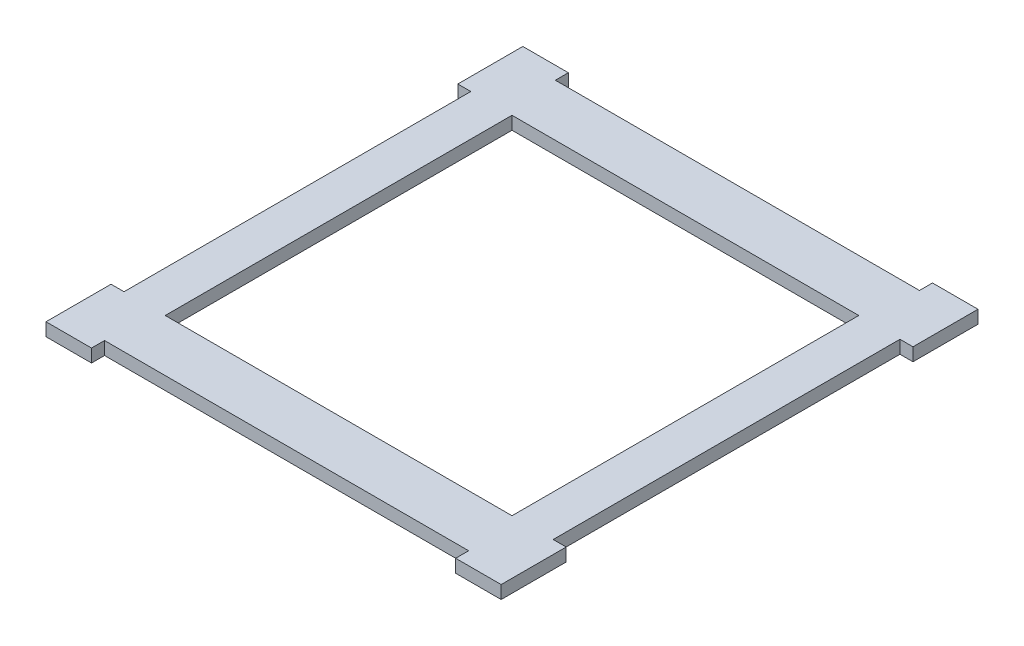
ISO-10303-21;
HEADER;
FILE_DESCRIPTION(('STEP AP214'),'2;1');
FILE_NAME('part.step','',(''),(''),'','','');
FILE_SCHEMA(('AUTOMOTIVE_DESIGN { 1 0 10303 214 1 1 1 1 }'));
ENDSEC;
DATA;
#1=APPLICATION_CONTEXT('core data for automotive mechanical design processes');
#2=APPLICATION_PROTOCOL_DEFINITION('international standard','automotive_design',2000,#1);
#3=PRODUCT_CONTEXT('',#1,'mechanical');
#4=PRODUCT('Part','Part','',(#3));
#5=PRODUCT_RELATED_PRODUCT_CATEGORY('part','',(#4));
#6=PRODUCT_DEFINITION_FORMATION('','',#4);
#7=PRODUCT_DEFINITION_CONTEXT('part definition',#1,'design');
#8=PRODUCT_DEFINITION('design','',#6,#7);
#9=PRODUCT_DEFINITION_SHAPE('','',#8);
#10=(LENGTH_UNIT() NAMED_UNIT(*) SI_UNIT(.MILLI.,.METRE.));
#11=(NAMED_UNIT(*) PLANE_ANGLE_UNIT() SI_UNIT($,.RADIAN.));
#12=(NAMED_UNIT(*) SI_UNIT($,.STERADIAN.) SOLID_ANGLE_UNIT());
#13=UNCERTAINTY_MEASURE_WITH_UNIT(LENGTH_MEASURE(1.E-05),#10,'distance_accuracy_value','');
#14=(GEOMETRIC_REPRESENTATION_CONTEXT(3) GLOBAL_UNCERTAINTY_ASSIGNED_CONTEXT((#13)) GLOBAL_UNIT_ASSIGNED_CONTEXT((#10,
#11,#12)) REPRESENTATION_CONTEXT('',''));
#15=CARTESIAN_POINT('',(0.,0.,0.));
#16=DIRECTION('',(0.,0.,1.));
#17=DIRECTION('',(1.,0.,0.));
#18=AXIS2_PLACEMENT_3D('',#15,#16,#17);
#19=CARTESIAN_POINT('',(0.,3.,0.));
#20=DIRECTION('',(0.,1.,0.));
#21=DIRECTION('',(0.,0.,1.));
#22=AXIS2_PLACEMENT_3D('',#19,#20,#21);
#23=PLANE('',#22);
#24=DIRECTION('',(-1.,0.,0.));
#25=VECTOR('',#24,1.);
#26=CARTESIAN_POINT('',(-40.,3.,-40.));
#27=LINE('',#26,#25);
#28=CARTESIAN_POINT('',(40.,3.,-40.));
#29=VERTEX_POINT('',#28);
#30=CARTESIAN_POINT('',(-40.,3.,-40.));
#31=VERTEX_POINT('',#30);
#32=EDGE_CURVE('E256',#29,#31,#27,.T.);
#33=ORIENTED_EDGE('',*,*,#32,.F.);
#34=DIRECTION('',(0.,0.,-1.));
#35=VECTOR('',#34,1.);
#36=CARTESIAN_POINT('',(40.,3.,-40.));
#37=LINE('',#36,#35);
#38=CARTESIAN_POINT('',(40.,3.,40.));
#39=VERTEX_POINT('',#38);
#40=EDGE_CURVE('E254',#39,#29,#37,.T.);
#41=ORIENTED_EDGE('',*,*,#40,.F.);
#42=DIRECTION('',(1.,0.,0.));
#43=VECTOR('',#42,1.);
#44=CARTESIAN_POINT('',(-40.,3.,40.));
#45=LINE('',#44,#43);
#46=CARTESIAN_POINT('',(-40.,3.,40.));
#47=VERTEX_POINT('',#46);
#48=EDGE_CURVE('E262',#47,#39,#45,.T.);
#49=ORIENTED_EDGE('',*,*,#48,.F.);
#50=DIRECTION('',(0.,0.,1.));
#51=VECTOR('',#50,1.);
#52=CARTESIAN_POINT('',(-40.,3.,-40.));
#53=LINE('',#52,#51);
#54=EDGE_CURVE('E259',#31,#47,#53,.T.);
#55=ORIENTED_EDGE('',*,*,#54,.F.);
#56=EDGE_LOOP('',(#33,#41,#49,#55));
#57=FACE_BOUND('',#56,.T.);
#58=DIRECTION('',(1.,0.,0.));
#59=VECTOR('',#58,1.);
#60=CARTESIAN_POINT('',(0.,3.,55.));
#61=LINE('',#60,#59);
#62=CARTESIAN_POINT('',(42.,3.,55.));
#63=VERTEX_POINT('',#62);
#64=CARTESIAN_POINT('',(52.5,3.,55.));
#65=VERTEX_POINT('',#64);
#66=EDGE_CURVE('E208',#63,#65,#61,.T.);
#67=ORIENTED_EDGE('',*,*,#66,.T.);
#68=DIRECTION('',(0.,0.,-1.));
#69=VECTOR('',#68,1.);
#70=CARTESIAN_POINT('',(52.5,3.,0.));
#71=LINE('',#70,#69);
#72=CARTESIAN_POINT('',(52.5,3.,40.));
#73=VERTEX_POINT('',#72);
#74=EDGE_CURVE('E391',#65,#73,#71,.T.);
#75=ORIENTED_EDGE('',*,*,#74,.T.);
#76=DIRECTION('',(-1.,0.,0.));
#77=VECTOR('',#76,1.);
#78=CARTESIAN_POINT('',(0.,3.,40.));
#79=LINE('',#78,#77);
#80=CARTESIAN_POINT('',(49.5,3.,40.));
#81=VERTEX_POINT('',#80);
#82=EDGE_CURVE('E335',#73,#81,#79,.T.);
#83=ORIENTED_EDGE('',*,*,#82,.T.);
#84=DIRECTION('',(0.,0.,1.));
#85=VECTOR('',#84,1.);
#86=CARTESIAN_POINT('',(49.5,3.,0.));
#87=LINE('',#86,#85);
#88=CARTESIAN_POINT('',(49.5,3.,-40.));
#89=VERTEX_POINT('',#88);
#90=EDGE_CURVE('E332',#89,#81,#87,.T.);
#91=ORIENTED_EDGE('',*,*,#90,.F.);
#92=DIRECTION('',(-1.,0.,0.));
#93=VECTOR('',#92,1.);
#94=CARTESIAN_POINT('',(0.,3.,-40.));
#95=LINE('',#94,#93);
#96=CARTESIAN_POINT('',(52.5,3.,-40.));
#97=VERTEX_POINT('',#96);
#98=EDGE_CURVE('E337',#97,#89,#95,.T.);
#99=ORIENTED_EDGE('',*,*,#98,.F.);
#100=DIRECTION('',(0.,0.,1.));
#101=VECTOR('',#100,1.);
#102=CARTESIAN_POINT('',(52.5,3.,0.));
#103=LINE('',#102,#101);
#104=CARTESIAN_POINT('',(52.5,3.,-55.));
#105=VERTEX_POINT('',#104);
#106=EDGE_CURVE('E353',#105,#97,#103,.T.);
#107=ORIENTED_EDGE('',*,*,#106,.F.);
#108=DIRECTION('',(1.,0.,0.));
#109=VECTOR('',#108,1.);
#110=CARTESIAN_POINT('',(0.,3.,-55.));
#111=LINE('',#110,#109);
#112=CARTESIAN_POINT('',(42.,3.,-55.));
#113=VERTEX_POINT('',#112);
#114=EDGE_CURVE('E351',#113,#105,#111,.T.);
#115=ORIENTED_EDGE('',*,*,#114,.F.);
#116=DIRECTION('',(0.,0.,1.));
#117=VECTOR('',#116,1.);
#118=CARTESIAN_POINT('',(42.,3.,-57.));
#119=LINE('',#118,#117);
#120=CARTESIAN_POINT('',(42.,3.,-52.));
#121=VERTEX_POINT('',#120);
#122=EDGE_CURVE('E237',#113,#121,#119,.T.);
#123=ORIENTED_EDGE('',*,*,#122,.T.);
#124=DIRECTION('',(-1.,0.,0.));
#125=VECTOR('',#124,1.);
#126=CARTESIAN_POINT('',(-54.5,3.,-52.));
#127=LINE('',#126,#125);
#128=CARTESIAN_POINT('',(-42.,3.,-52.));
#129=VERTEX_POINT('',#128);
#130=EDGE_CURVE('E285',#121,#129,#127,.T.);
#131=ORIENTED_EDGE('',*,*,#130,.T.);
#132=DIRECTION('',(0.,0.,1.));
#133=VECTOR('',#132,1.);
#134=CARTESIAN_POINT('',(-42.,3.,-57.));
#135=LINE('',#134,#133);
#136=CARTESIAN_POINT('',(-42.,3.,-55.));
#137=VERTEX_POINT('',#136);
#138=EDGE_CURVE('E251',#137,#129,#135,.T.);
#139=ORIENTED_EDGE('',*,*,#138,.F.);
#140=DIRECTION('',(-1.,0.,0.));
#141=VECTOR('',#140,1.);
#142=CARTESIAN_POINT('',(0.,3.,-55.));
#143=LINE('',#142,#141);
#144=CARTESIAN_POINT('',(-52.5,3.,-55.));
#145=VERTEX_POINT('',#144);
#146=EDGE_CURVE('E362',#137,#145,#143,.T.);
#147=ORIENTED_EDGE('',*,*,#146,.T.);
#148=DIRECTION('',(0.,0.,1.));
#149=VECTOR('',#148,1.);
#150=CARTESIAN_POINT('',(-52.5,3.,0.));
#151=LINE('',#150,#149);
#152=CARTESIAN_POINT('',(-52.5,3.,-40.));
#153=VERTEX_POINT('',#152);
#154=EDGE_CURVE('E365',#145,#153,#151,.T.);
#155=ORIENTED_EDGE('',*,*,#154,.T.);
#156=DIRECTION('',(1.,0.,0.));
#157=VECTOR('',#156,1.);
#158=CARTESIAN_POINT('',(0.,3.,-40.));
#159=LINE('',#158,#157);
#160=CARTESIAN_POINT('',(-49.5,3.,-40.));
#161=VERTEX_POINT('',#160);
#162=EDGE_CURVE('E317',#153,#161,#159,.T.);
#163=ORIENTED_EDGE('',*,*,#162,.T.);
#164=DIRECTION('',(0.,0.,1.));
#165=VECTOR('',#164,1.);
#166=CARTESIAN_POINT('',(-49.5,3.,0.));
#167=LINE('',#166,#165);
#168=CARTESIAN_POINT('',(-49.5,3.,40.));
#169=VERTEX_POINT('',#168);
#170=EDGE_CURVE('E229',#161,#169,#167,.T.);
#171=ORIENTED_EDGE('',*,*,#170,.T.);
#172=DIRECTION('',(1.,0.,0.));
#173=VECTOR('',#172,1.);
#174=CARTESIAN_POINT('',(0.,3.,40.));
#175=LINE('',#174,#173);
#176=CARTESIAN_POINT('',(-52.5,3.,40.));
#177=VERTEX_POINT('',#176);
#178=EDGE_CURVE('E307',#177,#169,#175,.T.);
#179=ORIENTED_EDGE('',*,*,#178,.F.);
#180=DIRECTION('',(0.,0.,-1.));
#181=VECTOR('',#180,1.);
#182=CARTESIAN_POINT('',(-52.5,3.,0.));
#183=LINE('',#182,#181);
#184=CARTESIAN_POINT('',(-52.5,3.,55.));
#185=VERTEX_POINT('',#184);
#186=EDGE_CURVE('E63',#185,#177,#183,.T.);
#187=ORIENTED_EDGE('',*,*,#186,.F.);
#188=DIRECTION('',(-1.,0.,0.));
#189=VECTOR('',#188,1.);
#190=CARTESIAN_POINT('',(0.,3.,55.));
#191=LINE('',#190,#189);
#192=CARTESIAN_POINT('',(-42.,3.,55.));
#193=VERTEX_POINT('',#192);
#194=EDGE_CURVE('E378',#193,#185,#191,.T.);
#195=ORIENTED_EDGE('',*,*,#194,.F.);
#196=DIRECTION('',(0.,0.,-1.));
#197=VECTOR('',#196,1.);
#198=CARTESIAN_POINT('',(-42.,3.,57.));
#199=LINE('',#198,#197);
#200=CARTESIAN_POINT('',(-42.,3.,52.));
#201=VERTEX_POINT('',#200);
#202=EDGE_CURVE('E244',#193,#201,#199,.T.);
#203=ORIENTED_EDGE('',*,*,#202,.T.);
#204=DIRECTION('',(1.,0.,0.));
#205=VECTOR('',#204,1.);
#206=CARTESIAN_POINT('',(-54.5,3.,52.));
#207=LINE('',#206,#205);
#208=CARTESIAN_POINT('',(42.,3.,52.));
#209=VERTEX_POINT('',#208);
#210=EDGE_CURVE('E288',#201,#209,#207,.T.);
#211=ORIENTED_EDGE('',*,*,#210,.T.);
#212=DIRECTION('',(0.,0.,-1.));
#213=VECTOR('',#212,1.);
#214=CARTESIAN_POINT('',(42.,3.,57.));
#215=LINE('',#214,#213);
#216=EDGE_CURVE('E225',#63,#209,#215,.T.);
#217=ORIENTED_EDGE('',*,*,#216,.F.);
#218=EDGE_LOOP('',(#67,#75,#83,#91,#99,#107,#115,#123,#131,#139,#147,#155,#163,#171,#179,#187,
#195,#203,#211,#217));
#219=FACE_BOUND('',#218,.T.);
#220=ADVANCED_FACE('F41',(#57,#219),#23,.T.);
#221=CARTESIAN_POINT('',(0.,0.,0.));
#222=DIRECTION('',(0.,1.,0.));
#223=DIRECTION('',(0.,0.,1.));
#224=AXIS2_PLACEMENT_3D('',#221,#222,#223);
#225=PLANE('',#224);
#226=DIRECTION('',(0.,0.,-1.));
#227=VECTOR('',#226,1.);
#228=CARTESIAN_POINT('',(40.,0.,-40.));
#229=LINE('',#228,#227);
#230=CARTESIAN_POINT('',(40.,0.,40.));
#231=VERTEX_POINT('',#230);
#232=CARTESIAN_POINT('',(40.,0.,-40.));
#233=VERTEX_POINT('',#232);
#234=EDGE_CURVE('E253',#231,#233,#229,.T.);
#235=ORIENTED_EDGE('',*,*,#234,.T.);
#236=DIRECTION('',(-1.,0.,0.));
#237=VECTOR('',#236,1.);
#238=CARTESIAN_POINT('',(-40.,0.,-40.));
#239=LINE('',#238,#237);
#240=CARTESIAN_POINT('',(-40.,0.,-40.));
#241=VERTEX_POINT('',#240);
#242=EDGE_CURVE('E267',#233,#241,#239,.T.);
#243=ORIENTED_EDGE('',*,*,#242,.T.);
#244=DIRECTION('',(0.,0.,1.));
#245=VECTOR('',#244,1.);
#246=CARTESIAN_POINT('',(-40.,0.,-40.));
#247=LINE('',#246,#245);
#248=CARTESIAN_POINT('',(-40.,0.,40.));
#249=VERTEX_POINT('',#248);
#250=EDGE_CURVE('E270',#241,#249,#247,.T.);
#251=ORIENTED_EDGE('',*,*,#250,.T.);
#252=DIRECTION('',(1.,0.,0.));
#253=VECTOR('',#252,1.);
#254=CARTESIAN_POINT('',(-40.,0.,40.));
#255=LINE('',#254,#253);
#256=EDGE_CURVE('E257',#249,#231,#255,.T.);
#257=ORIENTED_EDGE('',*,*,#256,.T.);
#258=EDGE_LOOP('',(#235,#243,#251,#257));
#259=FACE_BOUND('',#258,.T.);
#260=DIRECTION('',(0.,0.,1.));
#261=VECTOR('',#260,1.);
#262=CARTESIAN_POINT('',(52.5,0.,0.));
#263=LINE('',#262,#261);
#264=CARTESIAN_POINT('',(52.5,0.,40.));
#265=VERTEX_POINT('',#264);
#266=CARTESIAN_POINT('',(52.5,0.,55.));
#267=VERTEX_POINT('',#266);
#268=EDGE_CURVE('E56',#265,#267,#263,.T.);
#269=ORIENTED_EDGE('',*,*,#268,.T.);
#270=DIRECTION('',(-1.,0.,0.));
#271=VECTOR('',#270,1.);
#272=CARTESIAN_POINT('',(0.,0.,55.));
#273=LINE('',#272,#271);
#274=CARTESIAN_POINT('',(42.,0.,55.));
#275=VERTEX_POINT('',#274);
#276=EDGE_CURVE('E206',#267,#275,#273,.T.);
#277=ORIENTED_EDGE('',*,*,#276,.T.);
#278=DIRECTION('',(0.,0.,-1.));
#279=VECTOR('',#278,1.);
#280=CARTESIAN_POINT('',(42.,0.,57.));
#281=LINE('',#280,#279);
#282=CARTESIAN_POINT('',(42.,0.,52.));
#283=VERTEX_POINT('',#282);
#284=EDGE_CURVE('E217',#275,#283,#281,.T.);
#285=ORIENTED_EDGE('',*,*,#284,.T.);
#286=DIRECTION('',(1.,0.,0.));
#287=VECTOR('',#286,1.);
#288=CARTESIAN_POINT('',(-54.5,0.,52.));
#289=LINE('',#288,#287);
#290=CARTESIAN_POINT('',(-42.,0.,52.));
#291=VERTEX_POINT('',#290);
#292=EDGE_CURVE('E289',#291,#283,#289,.T.);
#293=ORIENTED_EDGE('',*,*,#292,.F.);
#294=DIRECTION('',(0.,0.,-1.));
#295=VECTOR('',#294,1.);
#296=CARTESIAN_POINT('',(-42.,0.,57.));
#297=LINE('',#296,#295);
#298=CARTESIAN_POINT('',(-42.,0.,55.));
#299=VERTEX_POINT('',#298);
#300=EDGE_CURVE('E242',#299,#291,#297,.T.);
#301=ORIENTED_EDGE('',*,*,#300,.F.);
#302=DIRECTION('',(1.,0.,0.));
#303=VECTOR('',#302,1.);
#304=CARTESIAN_POINT('',(0.,0.,55.));
#305=LINE('',#304,#303);
#306=CARTESIAN_POINT('',(-52.5,0.,55.));
#307=VERTEX_POINT('',#306);
#308=EDGE_CURVE('E384',#307,#299,#305,.T.);
#309=ORIENTED_EDGE('',*,*,#308,.F.);
#310=DIRECTION('',(0.,0.,1.));
#311=VECTOR('',#310,1.);
#312=CARTESIAN_POINT('',(-52.5,0.,0.));
#313=LINE('',#312,#311);
#314=CARTESIAN_POINT('',(-52.5,0.,40.));
#315=VERTEX_POINT('',#314);
#316=EDGE_CURVE('E388',#315,#307,#313,.T.);
#317=ORIENTED_EDGE('',*,*,#316,.F.);
#318=DIRECTION('',(-1.,0.,0.));
#319=VECTOR('',#318,1.);
#320=CARTESIAN_POINT('',(0.,0.,40.));
#321=LINE('',#320,#319);
#322=CARTESIAN_POINT('',(-49.5,0.,40.));
#323=VERTEX_POINT('',#322);
#324=EDGE_CURVE('E310',#323,#315,#321,.T.);
#325=ORIENTED_EDGE('',*,*,#324,.F.);
#326=DIRECTION('',(0.,0.,-1.));
#327=VECTOR('',#326,1.);
#328=CARTESIAN_POINT('',(-49.5,0.,0.));
#329=LINE('',#328,#327);
#330=CARTESIAN_POINT('',(-49.5,0.,-40.));
#331=VERTEX_POINT('',#330);
#332=EDGE_CURVE('E329',#323,#331,#329,.T.);
#333=ORIENTED_EDGE('',*,*,#332,.T.);
#334=DIRECTION('',(-1.,0.,0.));
#335=VECTOR('',#334,1.);
#336=CARTESIAN_POINT('',(0.,0.,-40.));
#337=LINE('',#336,#335);
#338=CARTESIAN_POINT('',(-52.5,0.,-40.));
#339=VERTEX_POINT('',#338);
#340=EDGE_CURVE('E324',#331,#339,#337,.T.);
#341=ORIENTED_EDGE('',*,*,#340,.T.);
#342=DIRECTION('',(0.,0.,-1.));
#343=VECTOR('',#342,1.);
#344=CARTESIAN_POINT('',(-52.5,0.,0.));
#345=LINE('',#344,#343);
#346=CARTESIAN_POINT('',(-52.5,0.,-55.));
#347=VERTEX_POINT('',#346);
#348=EDGE_CURVE('E371',#339,#347,#345,.T.);
#349=ORIENTED_EDGE('',*,*,#348,.T.);
#350=DIRECTION('',(1.,0.,0.));
#351=VECTOR('',#350,1.);
#352=CARTESIAN_POINT('',(0.,0.,-55.));
#353=LINE('',#352,#351);
#354=CARTESIAN_POINT('',(-42.,0.,-55.));
#355=VERTEX_POINT('',#354);
#356=EDGE_CURVE('E375',#347,#355,#353,.T.);
#357=ORIENTED_EDGE('',*,*,#356,.T.);
#358=DIRECTION('',(0.,0.,1.));
#359=VECTOR('',#358,1.);
#360=CARTESIAN_POINT('',(-42.,0.,-57.));
#361=LINE('',#360,#359);
#362=CARTESIAN_POINT('',(-42.,0.,-52.));
#363=VERTEX_POINT('',#362);
#364=EDGE_CURVE('E249',#355,#363,#361,.T.);
#365=ORIENTED_EDGE('',*,*,#364,.T.);
#366=DIRECTION('',(-1.,0.,0.));
#367=VECTOR('',#366,1.);
#368=CARTESIAN_POINT('',(-54.5,0.,-52.));
#369=LINE('',#368,#367);
#370=CARTESIAN_POINT('',(42.,0.,-52.));
#371=VERTEX_POINT('',#370);
#372=EDGE_CURVE('E284',#371,#363,#369,.T.);
#373=ORIENTED_EDGE('',*,*,#372,.F.);
#374=DIRECTION('',(0.,0.,1.));
#375=VECTOR('',#374,1.);
#376=CARTESIAN_POINT('',(42.,0.,-57.));
#377=LINE('',#376,#375);
#378=CARTESIAN_POINT('',(42.,0.,-55.));
#379=VERTEX_POINT('',#378);
#380=EDGE_CURVE('E235',#379,#371,#377,.T.);
#381=ORIENTED_EDGE('',*,*,#380,.F.);
#382=DIRECTION('',(-1.,0.,0.));
#383=VECTOR('',#382,1.);
#384=CARTESIAN_POINT('',(0.,0.,-55.));
#385=LINE('',#384,#383);
#386=CARTESIAN_POINT('',(52.5,0.,-55.));
#387=VERTEX_POINT('',#386);
#388=EDGE_CURVE('E357',#387,#379,#385,.T.);
#389=ORIENTED_EDGE('',*,*,#388,.F.);
#390=DIRECTION('',(0.,0.,-1.));
#391=VECTOR('',#390,1.);
#392=CARTESIAN_POINT('',(52.5,0.,0.));
#393=LINE('',#392,#391);
#394=CARTESIAN_POINT('',(52.5,0.,-40.));
#395=VERTEX_POINT('',#394);
#396=EDGE_CURVE('E359',#395,#387,#393,.T.);
#397=ORIENTED_EDGE('',*,*,#396,.F.);
#398=DIRECTION('',(1.,0.,0.));
#399=VECTOR('',#398,1.);
#400=CARTESIAN_POINT('',(0.,0.,-40.));
#401=LINE('',#400,#399);
#402=CARTESIAN_POINT('',(49.5,0.,-40.));
#403=VERTEX_POINT('',#402);
#404=EDGE_CURVE('E345',#403,#395,#401,.T.);
#405=ORIENTED_EDGE('',*,*,#404,.F.);
#406=DIRECTION('',(0.,0.,-1.));
#407=VECTOR('',#406,1.);
#408=CARTESIAN_POINT('',(49.5,0.,0.));
#409=LINE('',#408,#407);
#410=CARTESIAN_POINT('',(49.5,0.,40.));
#411=VERTEX_POINT('',#410);
#412=EDGE_CURVE('E348',#411,#403,#409,.T.);
#413=ORIENTED_EDGE('',*,*,#412,.F.);
#414=DIRECTION('',(1.,0.,0.));
#415=VECTOR('',#414,1.);
#416=CARTESIAN_POINT('',(0.,0.,40.));
#417=LINE('',#416,#415);
#418=EDGE_CURVE('E342',#411,#265,#417,.T.);
#419=ORIENTED_EDGE('',*,*,#418,.T.);
#420=EDGE_LOOP('',(#269,#277,#285,#293,#301,#309,#317,#325,#333,#341,#349,#357,#365,#373,#381,
#389,#397,#405,#413,#419));
#421=FACE_BOUND('',#420,.T.);
#422=ADVANCED_FACE('F215',(#259,#421),#225,.F.);
#423=CARTESIAN_POINT('',(42.,3.,57.));
#424=DIRECTION('',(1.,0.,0.));
#425=DIRECTION('',(0.,0.,-1.));
#426=AXIS2_PLACEMENT_3D('',#423,#424,#425);
#427=PLANE('',#426);
#428=DIRECTION('',(0.,-1.,0.));
#429=VECTOR('',#428,1.);
#430=CARTESIAN_POINT('',(42.,10.,55.));
#431=LINE('',#430,#429);
#432=EDGE_CURVE('E202',#63,#275,#431,.T.);
#433=ORIENTED_EDGE('',*,*,#432,.F.);
#434=ORIENTED_EDGE('',*,*,#216,.T.);
#435=DIRECTION('',(0.,-1.,0.));
#436=VECTOR('',#435,1.);
#437=CARTESIAN_POINT('',(42.,3.,52.));
#438=LINE('',#437,#436);
#439=EDGE_CURVE('E224',#209,#283,#438,.T.);
#440=ORIENTED_EDGE('',*,*,#439,.T.);
#441=ORIENTED_EDGE('',*,*,#284,.F.);
#442=EDGE_LOOP('',(#433,#434,#440,#441));
#443=FACE_BOUND('',#442,.T.);
#444=ADVANCED_FACE('F222',(#443),#427,.F.);
#445=CARTESIAN_POINT('',(0.,5.,40.));
#446=DIRECTION('',(0.,0.,-1.));
#447=DIRECTION('',(-1.,0.,0.));
#448=AXIS2_PLACEMENT_3D('',#445,#446,#447);
#449=PLANE('',#448);
#450=ORIENTED_EDGE('',*,*,#82,.F.);
#451=DIRECTION('',(0.,-1.,0.));
#452=VECTOR('',#451,1.);
#453=CARTESIAN_POINT('',(52.5,5.,40.));
#454=LINE('',#453,#452);
#455=EDGE_CURVE('E12',#73,#265,#454,.T.);
#456=ORIENTED_EDGE('',*,*,#455,.T.);
#457=ORIENTED_EDGE('',*,*,#418,.F.);
#458=DIRECTION('',(0.,-1.,0.));
#459=VECTOR('',#458,1.);
#460=CARTESIAN_POINT('',(49.5,5.,40.));
#461=LINE('',#460,#459);
#462=EDGE_CURVE('E339',#81,#411,#461,.T.);
#463=ORIENTED_EDGE('',*,*,#462,.F.);
#464=EDGE_LOOP('',(#450,#456,#457,#463));
#465=FACE_BOUND('',#464,.T.);
#466=ADVANCED_FACE('F457',(#465),#449,.T.);
#467=CARTESIAN_POINT('',(-42.,3.,-57.));
#468=DIRECTION('',(-1.,0.,0.));
#469=DIRECTION('',(0.,0.,1.));
#470=AXIS2_PLACEMENT_3D('',#467,#468,#469);
#471=PLANE('',#470);
#472=DIRECTION('',(0.,-1.,0.));
#473=VECTOR('',#472,1.);
#474=CARTESIAN_POINT('',(-42.,10.,-55.));
#475=LINE('',#474,#473);
#476=EDGE_CURVE('E369',#137,#355,#475,.T.);
#477=ORIENTED_EDGE('',*,*,#476,.F.);
#478=ORIENTED_EDGE('',*,*,#138,.T.);
#479=DIRECTION('',(0.,-1.,0.));
#480=VECTOR('',#479,1.);
#481=CARTESIAN_POINT('',(-42.,3.,-52.));
#482=LINE('',#481,#480);
#483=EDGE_CURVE('E246',#129,#363,#482,.T.);
#484=ORIENTED_EDGE('',*,*,#483,.T.);
#485=ORIENTED_EDGE('',*,*,#364,.F.);
#486=EDGE_LOOP('',(#477,#478,#484,#485));
#487=FACE_BOUND('',#486,.T.);
#488=ADVANCED_FACE('F427',(#487),#471,.F.);
#489=CARTESIAN_POINT('',(0.,5.,-40.));
#490=DIRECTION('',(0.,0.,1.));
#491=DIRECTION('',(1.,0.,0.));
#492=AXIS2_PLACEMENT_3D('',#489,#490,#491);
#493=PLANE('',#492);
#494=ORIENTED_EDGE('',*,*,#162,.F.);
#495=DIRECTION('',(0.,-1.,0.));
#496=VECTOR('',#495,1.);
#497=CARTESIAN_POINT('',(-52.5,5.,-40.));
#498=LINE('',#497,#496);
#499=EDGE_CURVE('E301',#153,#339,#498,.T.);
#500=ORIENTED_EDGE('',*,*,#499,.T.);
#501=ORIENTED_EDGE('',*,*,#340,.F.);
#502=DIRECTION('',(0.,-1.,0.));
#503=VECTOR('',#502,1.);
#504=CARTESIAN_POINT('',(-49.5,5.,-40.));
#505=LINE('',#504,#503);
#506=EDGE_CURVE('E318',#161,#331,#505,.T.);
#507=ORIENTED_EDGE('',*,*,#506,.F.);
#508=EDGE_LOOP('',(#494,#500,#501,#507));
#509=FACE_BOUND('',#508,.T.);
#510=ADVANCED_FACE('F416',(#509),#493,.T.);
#511=CARTESIAN_POINT('',(-54.5,3.,52.));
#512=DIRECTION('',(0.,0.,-1.));
#513=DIRECTION('',(-1.,0.,0.));
#514=AXIS2_PLACEMENT_3D('',#511,#512,#513);
#515=PLANE('',#514);
#516=ORIENTED_EDGE('',*,*,#439,.F.);
#517=ORIENTED_EDGE('',*,*,#210,.F.);
#518=DIRECTION('',(0.,-1.,0.));
#519=VECTOR('',#518,1.);
#520=CARTESIAN_POINT('',(-42.,3.,52.));
#521=LINE('',#520,#519);
#522=EDGE_CURVE('E239',#201,#291,#521,.T.);
#523=ORIENTED_EDGE('',*,*,#522,.T.);
#524=ORIENTED_EDGE('',*,*,#292,.T.);
#525=EDGE_LOOP('',(#516,#517,#523,#524));
#526=FACE_BOUND('',#525,.T.);
#527=ADVANCED_FACE('F399',(#526),#515,.F.);
#528=CARTESIAN_POINT('',(-54.5,3.,-52.));
#529=DIRECTION('',(0.,0.,1.));
#530=DIRECTION('',(1.,0.,0.));
#531=AXIS2_PLACEMENT_3D('',#528,#529,#530);
#532=PLANE('',#531);
#533=DIRECTION('',(0.,-1.,0.));
#534=VECTOR('',#533,1.);
#535=CARTESIAN_POINT('',(42.,3.,-52.));
#536=LINE('',#535,#534);
#537=EDGE_CURVE('E227',#121,#371,#536,.T.);
#538=ORIENTED_EDGE('',*,*,#537,.T.);
#539=ORIENTED_EDGE('',*,*,#372,.T.);
#540=ORIENTED_EDGE('',*,*,#483,.F.);
#541=ORIENTED_EDGE('',*,*,#130,.F.);
#542=EDGE_LOOP('',(#538,#539,#540,#541));
#543=FACE_BOUND('',#542,.T.);
#544=ADVANCED_FACE('F43',(#543),#532,.F.);
#545=CARTESIAN_POINT('',(40.,3.,-40.));
#546=DIRECTION('',(-1.,0.,0.));
#547=DIRECTION('',(0.,0.,1.));
#548=AXIS2_PLACEMENT_3D('',#545,#546,#547);
#549=PLANE('',#548);
#550=ORIENTED_EDGE('',*,*,#234,.F.);
#551=DIRECTION('',(0.,-1.,0.));
#552=VECTOR('',#551,1.);
#553=CARTESIAN_POINT('',(40.,3.,40.));
#554=LINE('',#553,#552);
#555=EDGE_CURVE('E264',#39,#231,#554,.T.);
#556=ORIENTED_EDGE('',*,*,#555,.F.);
#557=ORIENTED_EDGE('',*,*,#40,.T.);
#558=DIRECTION('',(0.,-1.,0.));
#559=VECTOR('',#558,1.);
#560=CARTESIAN_POINT('',(40.,3.,-40.));
#561=LINE('',#560,#559);
#562=EDGE_CURVE('E281',#29,#233,#561,.T.);
#563=ORIENTED_EDGE('',*,*,#562,.T.);
#564=EDGE_LOOP('',(#550,#556,#557,#563));
#565=FACE_BOUND('',#564,.T.);
#566=ADVANCED_FACE('F479',(#565),#549,.T.);
#567=CARTESIAN_POINT('',(-40.,3.,-40.));
#568=DIRECTION('',(0.,0.,1.));
#569=DIRECTION('',(1.,0.,0.));
#570=AXIS2_PLACEMENT_3D('',#567,#568,#569);
#571=PLANE('',#570);
#572=ORIENTED_EDGE('',*,*,#242,.F.);
#573=ORIENTED_EDGE('',*,*,#562,.F.);
#574=ORIENTED_EDGE('',*,*,#32,.T.);
#575=DIRECTION('',(0.,-1.,0.));
#576=VECTOR('',#575,1.);
#577=CARTESIAN_POINT('',(-40.,3.,-40.));
#578=LINE('',#577,#576);
#579=EDGE_CURVE('E279',#31,#241,#578,.T.);
#580=ORIENTED_EDGE('',*,*,#579,.T.);
#581=EDGE_LOOP('',(#572,#573,#574,#580));
#582=FACE_BOUND('',#581,.T.);
#583=ADVANCED_FACE('F505',(#582),#571,.T.);
#584=CARTESIAN_POINT('',(-40.,3.,-40.));
#585=DIRECTION('',(1.,0.,0.));
#586=DIRECTION('',(0.,0.,-1.));
#587=AXIS2_PLACEMENT_3D('',#584,#585,#586);
#588=PLANE('',#587);
#589=ORIENTED_EDGE('',*,*,#250,.F.);
#590=ORIENTED_EDGE('',*,*,#579,.F.);
#591=ORIENTED_EDGE('',*,*,#54,.T.);
#592=DIRECTION('',(0.,-1.,0.));
#593=VECTOR('',#592,1.);
#594=CARTESIAN_POINT('',(-40.,3.,40.));
#595=LINE('',#594,#593);
#596=EDGE_CURVE('E277',#47,#249,#595,.T.);
#597=ORIENTED_EDGE('',*,*,#596,.T.);
#598=EDGE_LOOP('',(#589,#590,#591,#597));
#599=FACE_BOUND('',#598,.T.);
#600=ADVANCED_FACE('F502',(#599),#588,.T.);
#601=CARTESIAN_POINT('',(-40.,3.,40.));
#602=DIRECTION('',(0.,0.,-1.));
#603=DIRECTION('',(-1.,0.,0.));
#604=AXIS2_PLACEMENT_3D('',#601,#602,#603);
#605=PLANE('',#604);
#606=ORIENTED_EDGE('',*,*,#256,.F.);
#607=ORIENTED_EDGE('',*,*,#596,.F.);
#608=ORIENTED_EDGE('',*,*,#48,.T.);
#609=ORIENTED_EDGE('',*,*,#555,.T.);
#610=EDGE_LOOP('',(#606,#607,#608,#609));
#611=FACE_BOUND('',#610,.T.);
#612=ADVANCED_FACE('F498',(#611),#605,.T.);
#613=CARTESIAN_POINT('',(-42.,3.,57.));
#614=DIRECTION('',(-1.,0.,0.));
#615=DIRECTION('',(0.,0.,-1.));
#616=AXIS2_PLACEMENT_3D('',#613,#614,#615);
#617=PLANE('',#616);
#618=ORIENTED_EDGE('',*,*,#202,.F.);
#619=DIRECTION('',(0.,-1.,0.));
#620=VECTOR('',#619,1.);
#621=CARTESIAN_POINT('',(-42.,10.,55.));
#622=LINE('',#621,#620);
#623=EDGE_CURVE('E381',#193,#299,#622,.T.);
#624=ORIENTED_EDGE('',*,*,#623,.T.);
#625=ORIENTED_EDGE('',*,*,#300,.T.);
#626=ORIENTED_EDGE('',*,*,#522,.F.);
#627=EDGE_LOOP('',(#618,#624,#625,#626));
#628=FACE_BOUND('',#627,.T.);
#629=ADVANCED_FACE('F405',(#628),#617,.F.);
#630=CARTESIAN_POINT('',(42.,3.,-57.));
#631=DIRECTION('',(1.,0.,0.));
#632=DIRECTION('',(0.,0.,1.));
#633=AXIS2_PLACEMENT_3D('',#630,#631,#632);
#634=PLANE('',#633);
#635=ORIENTED_EDGE('',*,*,#122,.F.);
#636=DIRECTION('',(0.,-1.,0.));
#637=VECTOR('',#636,1.);
#638=CARTESIAN_POINT('',(42.,3.,-55.));
#639=LINE('',#638,#637);
#640=EDGE_CURVE('E298',#113,#379,#639,.T.);
#641=ORIENTED_EDGE('',*,*,#640,.T.);
#642=ORIENTED_EDGE('',*,*,#380,.T.);
#643=ORIENTED_EDGE('',*,*,#537,.F.);
#644=EDGE_LOOP('',(#635,#641,#642,#643));
#645=FACE_BOUND('',#644,.T.);
#646=ADVANCED_FACE('F436',(#645),#634,.F.);
#647=CARTESIAN_POINT('',(-49.5,5.,0.));
#648=DIRECTION('',(-1.,0.,0.));
#649=DIRECTION('',(0.,0.,1.));
#650=AXIS2_PLACEMENT_3D('',#647,#648,#649);
#651=PLANE('',#650);
#652=ORIENTED_EDGE('',*,*,#506,.T.);
#653=ORIENTED_EDGE('',*,*,#332,.F.);
#654=DIRECTION('',(0.,-1.,0.));
#655=VECTOR('',#654,1.);
#656=CARTESIAN_POINT('',(-49.5,5.,40.));
#657=LINE('',#656,#655);
#658=EDGE_CURVE('E321',#169,#323,#657,.T.);
#659=ORIENTED_EDGE('',*,*,#658,.F.);
#660=ORIENTED_EDGE('',*,*,#170,.F.);
#661=EDGE_LOOP('',(#652,#653,#659,#660));
#662=FACE_BOUND('',#661,.T.);
#663=ADVANCED_FACE('F412',(#662),#651,.T.);
#664=CARTESIAN_POINT('',(0.,5.,40.));
#665=DIRECTION('',(0.,0.,1.));
#666=DIRECTION('',(1.,0.,0.));
#667=AXIS2_PLACEMENT_3D('',#664,#665,#666);
#668=PLANE('',#667);
#669=ORIENTED_EDGE('',*,*,#324,.T.);
#670=DIRECTION('',(0.,1.,0.));
#671=VECTOR('',#670,1.);
#672=CARTESIAN_POINT('',(-52.5,5.,40.));
#673=LINE('',#672,#671);
#674=EDGE_CURVE('E49',#315,#177,#673,.T.);
#675=ORIENTED_EDGE('',*,*,#674,.T.);
#676=ORIENTED_EDGE('',*,*,#178,.T.);
#677=ORIENTED_EDGE('',*,*,#658,.T.);
#678=EDGE_LOOP('',(#669,#675,#676,#677));
#679=FACE_BOUND('',#678,.T.);
#680=ADVANCED_FACE('F306',(#679),#668,.F.);
#681=CARTESIAN_POINT('',(49.5,5.,0.));
#682=DIRECTION('',(-1.,0.,0.));
#683=DIRECTION('',(0.,0.,1.));
#684=AXIS2_PLACEMENT_3D('',#681,#682,#683);
#685=PLANE('',#684);
#686=ORIENTED_EDGE('',*,*,#90,.T.);
#687=ORIENTED_EDGE('',*,*,#462,.T.);
#688=ORIENTED_EDGE('',*,*,#412,.T.);
#689=DIRECTION('',(0.,-1.,0.));
#690=VECTOR('',#689,1.);
#691=CARTESIAN_POINT('',(49.5,5.,-40.));
#692=LINE('',#691,#690);
#693=EDGE_CURVE('E340',#89,#403,#692,.T.);
#694=ORIENTED_EDGE('',*,*,#693,.F.);
#695=EDGE_LOOP('',(#686,#687,#688,#694));
#696=FACE_BOUND('',#695,.T.);
#697=ADVANCED_FACE('F454',(#696),#685,.F.);
#698=CARTESIAN_POINT('',(0.,5.,-40.));
#699=DIRECTION('',(0.,0.,-1.));
#700=DIRECTION('',(-1.,0.,0.));
#701=AXIS2_PLACEMENT_3D('',#698,#699,#700);
#702=PLANE('',#701);
#703=ORIENTED_EDGE('',*,*,#404,.T.);
#704=DIRECTION('',(0.,1.,0.));
#705=VECTOR('',#704,1.);
#706=CARTESIAN_POINT('',(52.5,5.,-40.));
#707=LINE('',#706,#705);
#708=EDGE_CURVE('E292',#395,#97,#707,.T.);
#709=ORIENTED_EDGE('',*,*,#708,.T.);
#710=ORIENTED_EDGE('',*,*,#98,.T.);
#711=ORIENTED_EDGE('',*,*,#693,.T.);
#712=EDGE_LOOP('',(#703,#709,#710,#711));
#713=FACE_BOUND('',#712,.T.);
#714=ADVANCED_FACE('F449',(#713),#702,.F.);
#715=CARTESIAN_POINT('',(0.,10.,-55.));
#716=DIRECTION('',(0.,0.,1.));
#717=DIRECTION('',(1.,0.,0.));
#718=AXIS2_PLACEMENT_3D('',#715,#716,#717);
#719=PLANE('',#718);
#720=ORIENTED_EDGE('',*,*,#114,.T.);
#721=DIRECTION('',(0.,-1.,0.));
#722=VECTOR('',#721,1.);
#723=CARTESIAN_POINT('',(52.5,10.,-55.));
#724=LINE('',#723,#722);
#725=EDGE_CURVE('E355',#105,#387,#724,.T.);
#726=ORIENTED_EDGE('',*,*,#725,.T.);
#727=ORIENTED_EDGE('',*,*,#388,.T.);
#728=ORIENTED_EDGE('',*,*,#640,.F.);
#729=EDGE_LOOP('',(#720,#726,#727,#728));
#730=FACE_BOUND('',#729,.T.);
#731=ADVANCED_FACE('F441',(#730),#719,.F.);
#732=CARTESIAN_POINT('',(52.5,10.,0.));
#733=DIRECTION('',(-1.,0.,0.));
#734=DIRECTION('',(0.,0.,1.));
#735=AXIS2_PLACEMENT_3D('',#732,#733,#734);
#736=PLANE('',#735);
#737=ORIENTED_EDGE('',*,*,#106,.T.);
#738=ORIENTED_EDGE('',*,*,#708,.F.);
#739=ORIENTED_EDGE('',*,*,#396,.T.);
#740=ORIENTED_EDGE('',*,*,#725,.F.);
#741=EDGE_LOOP('',(#737,#738,#739,#740));
#742=FACE_BOUND('',#741,.T.);
#743=ADVANCED_FACE('F446',(#742),#736,.F.);
#744=CARTESIAN_POINT('',(-52.5,10.,0.));
#745=DIRECTION('',(-1.,0.,0.));
#746=DIRECTION('',(0.,0.,1.));
#747=AXIS2_PLACEMENT_3D('',#744,#745,#746);
#748=PLANE('',#747);
#749=DIRECTION('',(0.,-1.,0.));
#750=VECTOR('',#749,1.);
#751=CARTESIAN_POINT('',(-52.5,10.,-55.));
#752=LINE('',#751,#750);
#753=EDGE_CURVE('E368',#145,#347,#752,.T.);
#754=ORIENTED_EDGE('',*,*,#753,.T.);
#755=ORIENTED_EDGE('',*,*,#348,.F.);
#756=ORIENTED_EDGE('',*,*,#499,.F.);
#757=ORIENTED_EDGE('',*,*,#154,.F.);
#758=EDGE_LOOP('',(#754,#755,#756,#757));
#759=FACE_BOUND('',#758,.T.);
#760=ADVANCED_FACE('F418',(#759),#748,.T.);
#761=CARTESIAN_POINT('',(0.,10.,-55.));
#762=DIRECTION('',(0.,0.,-1.));
#763=DIRECTION('',(-1.,0.,0.));
#764=AXIS2_PLACEMENT_3D('',#761,#762,#763);
#765=PLANE('',#764);
#766=ORIENTED_EDGE('',*,*,#476,.T.);
#767=ORIENTED_EDGE('',*,*,#356,.F.);
#768=ORIENTED_EDGE('',*,*,#753,.F.);
#769=ORIENTED_EDGE('',*,*,#146,.F.);
#770=EDGE_LOOP('',(#766,#767,#768,#769));
#771=FACE_BOUND('',#770,.T.);
#772=ADVANCED_FACE('F423',(#771),#765,.T.);
#773=CARTESIAN_POINT('',(0.,10.,55.));
#774=DIRECTION('',(0.,0.,-1.));
#775=DIRECTION('',(-1.,0.,0.));
#776=AXIS2_PLACEMENT_3D('',#773,#774,#775);
#777=PLANE('',#776);
#778=ORIENTED_EDGE('',*,*,#194,.T.);
#779=DIRECTION('',(0.,-1.,0.));
#780=VECTOR('',#779,1.);
#781=CARTESIAN_POINT('',(-52.5,10.,55.));
#782=LINE('',#781,#780);
#783=EDGE_CURVE('E382',#185,#307,#782,.T.);
#784=ORIENTED_EDGE('',*,*,#783,.T.);
#785=ORIENTED_EDGE('',*,*,#308,.T.);
#786=ORIENTED_EDGE('',*,*,#623,.F.);
#787=EDGE_LOOP('',(#778,#784,#785,#786));
#788=FACE_BOUND('',#787,.T.);
#789=ADVANCED_FACE('F407',(#788),#777,.F.);
#790=CARTESIAN_POINT('',(-52.5,10.,0.));
#791=DIRECTION('',(1.,0.,0.));
#792=DIRECTION('',(0.,0.,-1.));
#793=AXIS2_PLACEMENT_3D('',#790,#791,#792);
#794=PLANE('',#793);
#795=ORIENTED_EDGE('',*,*,#186,.T.);
#796=ORIENTED_EDGE('',*,*,#674,.F.);
#797=ORIENTED_EDGE('',*,*,#316,.T.);
#798=ORIENTED_EDGE('',*,*,#783,.F.);
#799=EDGE_LOOP('',(#795,#796,#797,#798));
#800=FACE_BOUND('',#799,.T.);
#801=ADVANCED_FACE('F408',(#800),#794,.F.);
#802=CARTESIAN_POINT('',(52.5,10.,0.));
#803=DIRECTION('',(1.,0.,0.));
#804=DIRECTION('',(0.,0.,-1.));
#805=AXIS2_PLACEMENT_3D('',#802,#803,#804);
#806=PLANE('',#805);
#807=DIRECTION('',(0.,-1.,0.));
#808=VECTOR('',#807,1.);
#809=CARTESIAN_POINT('',(52.5,10.,55.));
#810=LINE('',#809,#808);
#811=EDGE_CURVE('E212',#65,#267,#810,.T.);
#812=ORIENTED_EDGE('',*,*,#811,.T.);
#813=ORIENTED_EDGE('',*,*,#268,.F.);
#814=ORIENTED_EDGE('',*,*,#455,.F.);
#815=ORIENTED_EDGE('',*,*,#74,.F.);
#816=EDGE_LOOP('',(#812,#813,#814,#815));
#817=FACE_BOUND('',#816,.T.);
#818=ADVANCED_FACE('F395',(#817),#806,.T.);
#819=CARTESIAN_POINT('',(0.,10.,55.));
#820=DIRECTION('',(0.,0.,1.));
#821=DIRECTION('',(1.,0.,0.));
#822=AXIS2_PLACEMENT_3D('',#819,#820,#821);
#823=PLANE('',#822);
#824=ORIENTED_EDGE('',*,*,#432,.T.);
#825=ORIENTED_EDGE('',*,*,#276,.F.);
#826=ORIENTED_EDGE('',*,*,#811,.F.);
#827=ORIENTED_EDGE('',*,*,#66,.F.);
#828=EDGE_LOOP('',(#824,#825,#826,#827));
#829=FACE_BOUND('',#828,.T.);
#830=ADVANCED_FACE('F204',(#829),#823,.T.);
#831=CLOSED_SHELL('',(#220,#422,#444,#466,#488,#510,#527,#544,#566,#583,#600,#612,#629,#646,
#663,#680,#697,#714,#731,#743,#760,#772,#789,#801,#818,#830));
#832=MANIFOLD_SOLID_BREP('B2',#831);
#833=ADVANCED_BREP_SHAPE_REPRESENTATION('',(#18,#832),#14);
#834=SHAPE_DEFINITION_REPRESENTATION(#9,#833);
ENDSEC;
END-ISO-10303-21;
